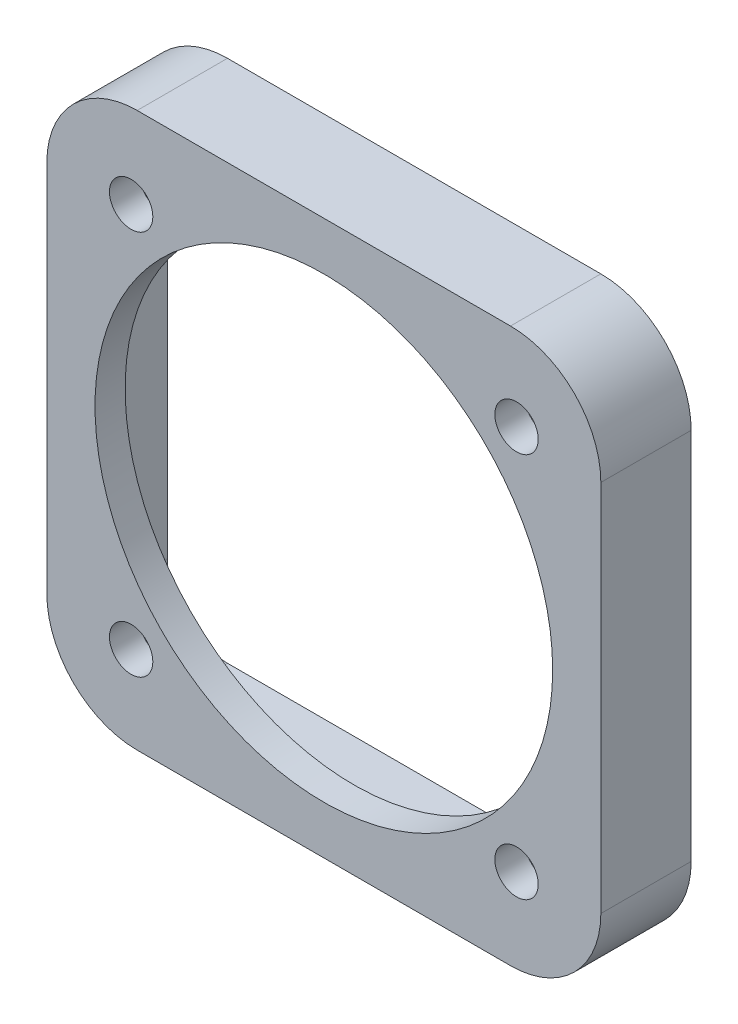
ISO-10303-21;
HEADER;
FILE_DESCRIPTION(('STEP AP214'),'2;1');
FILE_NAME('part.step','',(''),(''),'','','');
FILE_SCHEMA(('AUTOMOTIVE_DESIGN { 1 0 10303 214 1 1 1 1 }'));
ENDSEC;
DATA;
#1=APPLICATION_CONTEXT('core data for automotive mechanical design processes');
#2=APPLICATION_PROTOCOL_DEFINITION('international standard','automotive_design',2000,#1);
#3=PRODUCT_CONTEXT('',#1,'mechanical');
#4=PRODUCT('Part','Part','',(#3));
#5=PRODUCT_RELATED_PRODUCT_CATEGORY('part','',(#4));
#6=PRODUCT_DEFINITION_FORMATION('','',#4);
#7=PRODUCT_DEFINITION_CONTEXT('part definition',#1,'design');
#8=PRODUCT_DEFINITION('design','',#6,#7);
#9=PRODUCT_DEFINITION_SHAPE('','',#8);
#10=(LENGTH_UNIT() NAMED_UNIT(*) SI_UNIT(.MILLI.,.METRE.));
#11=(NAMED_UNIT(*) PLANE_ANGLE_UNIT() SI_UNIT($,.RADIAN.));
#12=(NAMED_UNIT(*) SI_UNIT($,.STERADIAN.) SOLID_ANGLE_UNIT());
#13=UNCERTAINTY_MEASURE_WITH_UNIT(LENGTH_MEASURE(1.E-05),#10,'distance_accuracy_value','');
#14=(GEOMETRIC_REPRESENTATION_CONTEXT(3) GLOBAL_UNCERTAINTY_ASSIGNED_CONTEXT((#13)) GLOBAL_UNIT_ASSIGNED_CONTEXT((#10,
#11,#12)) REPRESENTATION_CONTEXT('',''));
#15=CARTESIAN_POINT('',(0.,0.,0.));
#16=DIRECTION('',(0.,0.,1.));
#17=DIRECTION('',(1.,0.,0.));
#18=AXIS2_PLACEMENT_3D('',#15,#16,#17);
#19=CARTESIAN_POINT('',(0.,166.585877116278,-1997.5));
#20=DIRECTION('',(0.,1.,0.));
#21=DIRECTION('',(0.,0.,1.));
#22=AXIS2_PLACEMENT_3D('',#19,#20,#21);
#23=PLANE('',#22);
#24=DIRECTION('',(0.,0.,-1.));
#25=VECTOR('',#24,1.);
#26=CARTESIAN_POINT('',(133.898971859852,166.585877116278,-1997.5));
#27=LINE('',#26,#25);
#28=CARTESIAN_POINT('',(133.898971859852,166.585877116278,-1997.5));
#29=VERTEX_POINT('',#28);
#30=CARTESIAN_POINT('',(133.898971859852,166.585877116278,-2005.));
#31=VERTEX_POINT('',#30);
#32=EDGE_CURVE('E272',#29,#31,#27,.T.);
#33=ORIENTED_EDGE('',*,*,#32,.T.);
#34=DIRECTION('',(1.,0.,0.));
#35=VECTOR('',#34,1.);
#36=CARTESIAN_POINT('',(102.898971859852,166.585877116278,-2005.));
#37=LINE('',#36,#35);
#38=CARTESIAN_POINT('',(102.898971859852,166.585877116278,-2005.));
#39=VERTEX_POINT('',#38);
#40=EDGE_CURVE('E228',#39,#31,#37,.T.);
#41=ORIENTED_EDGE('',*,*,#40,.F.);
#42=DIRECTION('',(0.,0.,-1.));
#43=VECTOR('',#42,1.);
#44=CARTESIAN_POINT('',(102.898971859852,166.585877116278,-1997.5));
#45=LINE('',#44,#43);
#46=CARTESIAN_POINT('',(102.898971859852,166.585877116278,-1997.5));
#47=VERTEX_POINT('',#46);
#48=EDGE_CURVE('E11',#47,#39,#45,.T.);
#49=ORIENTED_EDGE('',*,*,#48,.F.);
#50=DIRECTION('',(1.,0.,0.));
#51=VECTOR('',#50,1.);
#52=CARTESIAN_POINT('',(0.,166.585877116278,-1997.5));
#53=LINE('',#52,#51);
#54=EDGE_CURVE('E250',#47,#29,#53,.T.);
#55=ORIENTED_EDGE('',*,*,#54,.T.);
#56=EDGE_LOOP('',(#33,#41,#49,#55));
#57=FACE_BOUND('',#56,.T.);
#58=ADVANCED_FACE('F41',(#57),#23,.T.);
#59=CARTESIAN_POINT('',(102.898971859852,159.085877116278,-1997.5));
#60=DIRECTION('',(0.,0.,-1.));
#61=DIRECTION('',(-1.,0.,0.));
#62=AXIS2_PLACEMENT_3D('',#59,#60,#61);
#63=CYLINDRICAL_SURFACE('',#62,7.49999999999999);
#64=ORIENTED_EDGE('',*,*,#48,.T.);
#65=CARTESIAN_POINT('',(102.898971859852,159.085877116278,-2005.));
#66=DIRECTION('',(0.,0.,-1.));
#67=DIRECTION('',(-1.,0.,0.));
#68=AXIS2_PLACEMENT_3D('',#65,#66,#67);
#69=CIRCLE('',#68,7.49999999999999);
#70=CARTESIAN_POINT('',(95.3989718598517,159.085877116278,-2005.));
#71=VERTEX_POINT('',#70);
#72=EDGE_CURVE('E171',#71,#39,#69,.T.);
#73=ORIENTED_EDGE('',*,*,#72,.F.);
#74=DIRECTION('',(0.,0.,-1.));
#75=VECTOR('',#74,1.);
#76=CARTESIAN_POINT('',(95.3989718598517,159.085877116278,-1997.5));
#77=LINE('',#76,#75);
#78=CARTESIAN_POINT('',(95.3989718598517,159.085877116278,-1997.5));
#79=VERTEX_POINT('',#78);
#80=EDGE_CURVE('E48',#79,#71,#77,.T.);
#81=ORIENTED_EDGE('',*,*,#80,.F.);
#82=CARTESIAN_POINT('',(102.898971859852,159.085877116278,-1997.5));
#83=DIRECTION('',(0.,0.,1.));
#84=DIRECTION('',(1.,0.,0.));
#85=AXIS2_PLACEMENT_3D('',#82,#83,#84);
#86=CIRCLE('',#85,7.49999999999999);
#87=EDGE_CURVE('E253',#47,#79,#86,.T.);
#88=ORIENTED_EDGE('',*,*,#87,.F.);
#89=EDGE_LOOP('',(#64,#73,#81,#88));
#90=FACE_BOUND('',#89,.T.);
#91=ADVANCED_FACE('F295',(#90),#63,.T.);
#92=CARTESIAN_POINT('',(95.3989718598518,0.,-1997.5));
#93=DIRECTION('',(-1.,0.,0.));
#94=DIRECTION('',(0.,-1.,0.));
#95=AXIS2_PLACEMENT_3D('',#92,#93,#94);
#96=PLANE('',#95);
#97=ORIENTED_EDGE('',*,*,#80,.T.);
#98=DIRECTION('',(0.,1.,0.));
#99=VECTOR('',#98,1.);
#100=CARTESIAN_POINT('',(95.3989718598517,128.085877116278,-2005.));
#101=LINE('',#100,#99);
#102=CARTESIAN_POINT('',(95.3989718598517,128.085877116278,-2005.));
#103=VERTEX_POINT('',#102);
#104=EDGE_CURVE('E246',#103,#71,#101,.T.);
#105=ORIENTED_EDGE('',*,*,#104,.F.);
#106=DIRECTION('',(0.,0.,-1.));
#107=VECTOR('',#106,1.);
#108=CARTESIAN_POINT('',(95.3989718598517,128.085877116278,-1997.5));
#109=LINE('',#108,#107);
#110=CARTESIAN_POINT('',(95.3989718598517,128.085877116278,-1997.5));
#111=VERTEX_POINT('',#110);
#112=EDGE_CURVE('E284',#111,#103,#109,.T.);
#113=ORIENTED_EDGE('',*,*,#112,.F.);
#114=DIRECTION('',(0.,1.,0.));
#115=VECTOR('',#114,1.);
#116=CARTESIAN_POINT('',(95.3989718598518,0.,-1997.5));
#117=LINE('',#116,#115);
#118=EDGE_CURVE('E255',#111,#79,#117,.T.);
#119=ORIENTED_EDGE('',*,*,#118,.T.);
#120=EDGE_LOOP('',(#97,#105,#113,#119));
#121=FACE_BOUND('',#120,.T.);
#122=ADVANCED_FACE('F288',(#121),#96,.T.);
#123=CARTESIAN_POINT('',(102.898971859852,128.085877116278,-1997.5));
#124=DIRECTION('',(0.,0.,-1.));
#125=DIRECTION('',(-1.,0.,0.));
#126=AXIS2_PLACEMENT_3D('',#123,#124,#125);
#127=CYLINDRICAL_SURFACE('',#126,7.49999999999999);
#128=ORIENTED_EDGE('',*,*,#112,.T.);
#129=CARTESIAN_POINT('',(102.898971859852,128.085877116278,-2005.));
#130=DIRECTION('',(0.,0.,-1.));
#131=DIRECTION('',(-1.,0.,0.));
#132=AXIS2_PLACEMENT_3D('',#129,#130,#131);
#133=CIRCLE('',#132,7.49999999999999);
#134=CARTESIAN_POINT('',(102.898971859852,120.585877116278,-2005.));
#135=VERTEX_POINT('',#134);
#136=EDGE_CURVE('E243',#135,#103,#133,.T.);
#137=ORIENTED_EDGE('',*,*,#136,.F.);
#138=DIRECTION('',(0.,0.,-1.));
#139=VECTOR('',#138,1.);
#140=CARTESIAN_POINT('',(102.898971859852,120.585877116278,-1997.5));
#141=LINE('',#140,#139);
#142=CARTESIAN_POINT('',(102.898971859852,120.585877116278,-1997.5));
#143=VERTEX_POINT('',#142);
#144=EDGE_CURVE('E282',#143,#135,#141,.T.);
#145=ORIENTED_EDGE('',*,*,#144,.F.);
#146=CARTESIAN_POINT('',(102.898971859852,128.085877116278,-1997.5));
#147=DIRECTION('',(0.,0.,1.));
#148=DIRECTION('',(1.,0.,0.));
#149=AXIS2_PLACEMENT_3D('',#146,#147,#148);
#150=CIRCLE('',#149,7.49999999999999);
#151=EDGE_CURVE('E258',#111,#143,#150,.T.);
#152=ORIENTED_EDGE('',*,*,#151,.F.);
#153=EDGE_LOOP('',(#128,#137,#145,#152));
#154=FACE_BOUND('',#153,.T.);
#155=ADVANCED_FACE('F315',(#154),#127,.T.);
#156=CARTESIAN_POINT('',(0.,120.585877116278,-1997.5));
#157=DIRECTION('',(0.,-1.,0.));
#158=DIRECTION('',(1.,0.,0.));
#159=AXIS2_PLACEMENT_3D('',#156,#157,#158);
#160=PLANE('',#159);
#161=ORIENTED_EDGE('',*,*,#144,.T.);
#162=DIRECTION('',(-1.,0.,0.));
#163=VECTOR('',#162,1.);
#164=CARTESIAN_POINT('',(133.898971859852,120.585877116278,-2005.));
#165=LINE('',#164,#163);
#166=CARTESIAN_POINT('',(133.898971859852,120.585877116278,-2005.));
#167=VERTEX_POINT('',#166);
#168=EDGE_CURVE('E240',#167,#135,#165,.T.);
#169=ORIENTED_EDGE('',*,*,#168,.F.);
#170=DIRECTION('',(0.,0.,-1.));
#171=VECTOR('',#170,1.);
#172=CARTESIAN_POINT('',(133.898971859852,120.585877116278,-1997.5));
#173=LINE('',#172,#171);
#174=CARTESIAN_POINT('',(133.898971859852,120.585877116278,-1997.5));
#175=VERTEX_POINT('',#174);
#176=EDGE_CURVE('E280',#175,#167,#173,.T.);
#177=ORIENTED_EDGE('',*,*,#176,.F.);
#178=DIRECTION('',(-1.,0.,0.));
#179=VECTOR('',#178,1.);
#180=CARTESIAN_POINT('',(0.,120.585877116278,-1997.5));
#181=LINE('',#180,#179);
#182=EDGE_CURVE('E260',#175,#143,#181,.T.);
#183=ORIENTED_EDGE('',*,*,#182,.T.);
#184=EDGE_LOOP('',(#161,#169,#177,#183));
#185=FACE_BOUND('',#184,.T.);
#186=ADVANCED_FACE('F312',(#185),#160,.T.);
#187=CARTESIAN_POINT('',(133.898971859852,128.085877116278,-1997.5));
#188=DIRECTION('',(0.,0.,-1.));
#189=DIRECTION('',(-1.,0.,0.));
#190=AXIS2_PLACEMENT_3D('',#187,#188,#189);
#191=CYLINDRICAL_SURFACE('',#190,7.49999999999998);
#192=ORIENTED_EDGE('',*,*,#176,.T.);
#193=CARTESIAN_POINT('',(133.898971859852,128.085877116278,-2005.));
#194=DIRECTION('',(0.,0.,-1.));
#195=DIRECTION('',(-1.,0.,0.));
#196=AXIS2_PLACEMENT_3D('',#193,#194,#195);
#197=CIRCLE('',#196,7.49999999999998);
#198=CARTESIAN_POINT('',(141.398971859852,128.085877116278,-2005.));
#199=VERTEX_POINT('',#198);
#200=EDGE_CURVE('E237',#199,#167,#197,.T.);
#201=ORIENTED_EDGE('',*,*,#200,.F.);
#202=DIRECTION('',(0.,0.,-1.));
#203=VECTOR('',#202,1.);
#204=CARTESIAN_POINT('',(141.398971859852,128.085877116278,-1997.5));
#205=LINE('',#204,#203);
#206=CARTESIAN_POINT('',(141.398971859852,128.085877116278,-1997.5));
#207=VERTEX_POINT('',#206);
#208=EDGE_CURVE('E278',#207,#199,#205,.T.);
#209=ORIENTED_EDGE('',*,*,#208,.F.);
#210=CARTESIAN_POINT('',(133.898971859852,128.085877116278,-1997.5));
#211=DIRECTION('',(0.,0.,1.));
#212=DIRECTION('',(1.,0.,0.));
#213=AXIS2_PLACEMENT_3D('',#210,#211,#212);
#214=CIRCLE('',#213,7.49999999999998);
#215=EDGE_CURVE('E263',#175,#207,#214,.T.);
#216=ORIENTED_EDGE('',*,*,#215,.F.);
#217=EDGE_LOOP('',(#192,#201,#209,#216));
#218=FACE_BOUND('',#217,.T.);
#219=ADVANCED_FACE('F308',(#218),#191,.T.);
#220=CARTESIAN_POINT('',(141.398971859852,0.,-1997.5));
#221=DIRECTION('',(1.,0.,0.));
#222=DIRECTION('',(0.,0.,-1.));
#223=AXIS2_PLACEMENT_3D('',#220,#221,#222);
#224=PLANE('',#223);
#225=ORIENTED_EDGE('',*,*,#208,.T.);
#226=DIRECTION('',(0.,-1.,0.));
#227=VECTOR('',#226,1.);
#228=CARTESIAN_POINT('',(141.398971859852,159.085877116278,-2005.));
#229=LINE('',#228,#227);
#230=CARTESIAN_POINT('',(141.398971859852,159.085877116278,-2005.));
#231=VERTEX_POINT('',#230);
#232=EDGE_CURVE('E234',#231,#199,#229,.T.);
#233=ORIENTED_EDGE('',*,*,#232,.F.);
#234=DIRECTION('',(0.,0.,-1.));
#235=VECTOR('',#234,1.);
#236=CARTESIAN_POINT('',(141.398971859852,159.085877116278,-1997.5));
#237=LINE('',#236,#235);
#238=CARTESIAN_POINT('',(141.398971859852,159.085877116278,-1997.5));
#239=VERTEX_POINT('',#238);
#240=EDGE_CURVE('E276',#239,#231,#237,.T.);
#241=ORIENTED_EDGE('',*,*,#240,.F.);
#242=DIRECTION('',(0.,-1.,0.));
#243=VECTOR('',#242,1.);
#244=CARTESIAN_POINT('',(141.398971859852,0.,-1997.5));
#245=LINE('',#244,#243);
#246=EDGE_CURVE('E265',#239,#207,#245,.T.);
#247=ORIENTED_EDGE('',*,*,#246,.T.);
#248=EDGE_LOOP('',(#225,#233,#241,#247));
#249=FACE_BOUND('',#248,.T.);
#250=ADVANCED_FACE('F303',(#249),#224,.T.);
#251=CARTESIAN_POINT('',(133.898971859852,159.085877116278,-1997.5));
#252=DIRECTION('',(0.,0.,-1.));
#253=DIRECTION('',(-1.,0.,0.));
#254=AXIS2_PLACEMENT_3D('',#251,#252,#253);
#255=CYLINDRICAL_SURFACE('',#254,7.49999999999998);
#256=ORIENTED_EDGE('',*,*,#240,.T.);
#257=CARTESIAN_POINT('',(133.898971859852,159.085877116278,-2005.));
#258=DIRECTION('',(0.,0.,-1.));
#259=DIRECTION('',(-1.,0.,0.));
#260=AXIS2_PLACEMENT_3D('',#257,#258,#259);
#261=CIRCLE('',#260,7.49999999999998);
#262=EDGE_CURVE('E231',#31,#231,#261,.T.);
#263=ORIENTED_EDGE('',*,*,#262,.F.);
#264=ORIENTED_EDGE('',*,*,#32,.F.);
#265=CARTESIAN_POINT('',(133.898971859852,159.085877116278,-1997.5));
#266=DIRECTION('',(0.,0.,1.));
#267=DIRECTION('',(1.,0.,0.));
#268=AXIS2_PLACEMENT_3D('',#265,#266,#267);
#269=CIRCLE('',#268,7.49999999999998);
#270=EDGE_CURVE('E63',#239,#29,#269,.T.);
#271=ORIENTED_EDGE('',*,*,#270,.F.);
#272=EDGE_LOOP('',(#256,#263,#264,#271));
#273=FACE_BOUND('',#272,.T.);
#274=ADVANCED_FACE('F301',(#273),#255,.T.);
#275=CARTESIAN_POINT('',(118.398971859852,143.585877116278,-1997.5));
#276=DIRECTION('',(0.,0.,-1.));
#277=DIRECTION('',(-1.,0.,0.));
#278=AXIS2_PLACEMENT_3D('',#275,#276,#277);
#279=CYLINDRICAL_SURFACE('',#278,19.);
#280=CARTESIAN_POINT('',(118.398971859852,143.585877116278,-1997.5));
#281=DIRECTION('',(0.,0.,1.));
#282=DIRECTION('',(1.,0.,0.));
#283=AXIS2_PLACEMENT_3D('',#280,#281,#282);
#284=CIRCLE('',#283,19.);
#285=CARTESIAN_POINT('',(137.398971859852,143.585877116278,-1997.5));
#286=VERTEX_POINT('',#285);
#287=EDGE_CURVE('E269',#286,#286,#284,.T.);
#288=ORIENTED_EDGE('',*,*,#287,.T.);
#289=EDGE_LOOP('',(#288));
#290=FACE_BOUND('',#289,.T.);
#291=CARTESIAN_POINT('',(118.398971859852,143.585877116278,-2000.));
#292=DIRECTION('',(0.,0.,1.));
#293=DIRECTION('',(1.,0.,0.));
#294=AXIS2_PLACEMENT_3D('',#291,#292,#293);
#295=CIRCLE('',#294,19.);
#296=CARTESIAN_POINT('',(137.398971859852,143.585877116278,-2000.));
#297=VERTEX_POINT('',#296);
#298=EDGE_CURVE('E249',#297,#297,#295,.T.);
#299=ORIENTED_EDGE('',*,*,#298,.F.);
#300=EDGE_LOOP('',(#299));
#301=FACE_BOUND('',#300,.T.);
#302=ADVANCED_FACE('F321',(#290,#301),#279,.F.);
#303=CARTESIAN_POINT('',(0.,0.,-1997.5));
#304=DIRECTION('',(0.,0.,1.));
#305=DIRECTION('',(1.,0.,0.));
#306=AXIS2_PLACEMENT_3D('',#303,#304,#305);
#307=PLANE('',#306);
#308=CARTESIAN_POINT('',(102.398971859852,159.585877116278,-1997.5));
#309=DIRECTION('',(0.,0.,1.));
#310=DIRECTION('',(1.,0.,0.));
#311=AXIS2_PLACEMENT_3D('',#308,#309,#310);
#312=CIRCLE('',#311,1.79999999999998);
#313=CARTESIAN_POINT('',(104.198971859852,159.585877116278,-1997.5));
#314=VERTEX_POINT('',#313);
#315=EDGE_CURVE('E601',#314,#314,#312,.T.);
#316=ORIENTED_EDGE('',*,*,#315,.F.);
#317=EDGE_LOOP('',(#316));
#318=FACE_BOUND('',#317,.T.);
#319=CARTESIAN_POINT('',(102.398971859852,127.585877116278,-1997.5));
#320=DIRECTION('',(0.,0.,1.));
#321=DIRECTION('',(1.,0.,0.));
#322=AXIS2_PLACEMENT_3D('',#319,#320,#321);
#323=CIRCLE('',#322,1.79999999999998);
#324=CARTESIAN_POINT('',(104.198971859852,127.585877116278,-1997.5));
#325=VERTEX_POINT('',#324);
#326=EDGE_CURVE('E603',#325,#325,#323,.T.);
#327=ORIENTED_EDGE('',*,*,#326,.F.);
#328=EDGE_LOOP('',(#327));
#329=FACE_BOUND('',#328,.T.);
#330=CARTESIAN_POINT('',(134.398971859852,127.585877116278,-1997.5));
#331=DIRECTION('',(0.,0.,1.));
#332=DIRECTION('',(1.,0.,0.));
#333=AXIS2_PLACEMENT_3D('',#330,#331,#332);
#334=CIRCLE('',#333,1.8);
#335=CARTESIAN_POINT('',(136.198971859852,127.585877116278,-1997.5));
#336=VERTEX_POINT('',#335);
#337=EDGE_CURVE('E611',#336,#336,#334,.T.);
#338=ORIENTED_EDGE('',*,*,#337,.F.);
#339=EDGE_LOOP('',(#338));
#340=FACE_BOUND('',#339,.T.);
#341=CARTESIAN_POINT('',(134.398971859852,159.585877116278,-1997.5));
#342=DIRECTION('',(0.,0.,1.));
#343=DIRECTION('',(1.,0.,0.));
#344=AXIS2_PLACEMENT_3D('',#341,#342,#343);
#345=CIRCLE('',#344,1.8);
#346=CARTESIAN_POINT('',(136.198971859852,159.585877116278,-1997.5));
#347=VERTEX_POINT('',#346);
#348=EDGE_CURVE('E617',#347,#347,#345,.T.);
#349=ORIENTED_EDGE('',*,*,#348,.F.);
#350=EDGE_LOOP('',(#349));
#351=FACE_BOUND('',#350,.T.);
#352=ORIENTED_EDGE('',*,*,#54,.F.);
#353=ORIENTED_EDGE('',*,*,#87,.T.);
#354=ORIENTED_EDGE('',*,*,#118,.F.);
#355=ORIENTED_EDGE('',*,*,#151,.T.);
#356=ORIENTED_EDGE('',*,*,#182,.F.);
#357=ORIENTED_EDGE('',*,*,#215,.T.);
#358=ORIENTED_EDGE('',*,*,#246,.F.);
#359=ORIENTED_EDGE('',*,*,#270,.T.);
#360=EDGE_LOOP('',(#352,#353,#354,#355,#356,#357,#358,#359));
#361=FACE_BOUND('',#360,.T.);
#362=ORIENTED_EDGE('',*,*,#287,.F.);
#363=EDGE_LOOP('',(#362));
#364=FACE_BOUND('',#363,.T.);
#365=ADVANCED_FACE('F317',(#318,#329,#340,#351,#361,#364),#307,.T.);
#366=CARTESIAN_POINT('',(0.,0.,-2000.));
#367=DIRECTION('',(0.,0.,1.));
#368=DIRECTION('',(1.,0.,0.));
#369=AXIS2_PLACEMENT_3D('',#366,#367,#368);
#370=PLANE('',#369);
#371=CARTESIAN_POINT('',(102.398971859852,159.585877116278,-2000.));
#372=DIRECTION('',(0.,0.,1.));
#373=DIRECTION('',(1.,0.,0.));
#374=AXIS2_PLACEMENT_3D('',#371,#372,#373);
#375=CIRCLE('',#374,1.79999999999999);
#376=CARTESIAN_POINT('',(104.198971859852,159.585877116278,-2000.));
#377=VERTEX_POINT('',#376);
#378=EDGE_CURVE('E598',#377,#377,#375,.T.);
#379=ORIENTED_EDGE('',*,*,#378,.T.);
#380=EDGE_LOOP('',(#379));
#381=FACE_BOUND('',#380,.T.);
#382=CARTESIAN_POINT('',(102.398971859852,127.585877116278,-2000.));
#383=DIRECTION('',(0.,0.,1.));
#384=DIRECTION('',(1.,0.,0.));
#385=AXIS2_PLACEMENT_3D('',#382,#383,#384);
#386=CIRCLE('',#385,1.79999999999999);
#387=CARTESIAN_POINT('',(104.198971859852,127.585877116278,-2000.));
#388=VERTEX_POINT('',#387);
#389=EDGE_CURVE('E608',#388,#388,#386,.T.);
#390=ORIENTED_EDGE('',*,*,#389,.T.);
#391=EDGE_LOOP('',(#390));
#392=FACE_BOUND('',#391,.T.);
#393=CARTESIAN_POINT('',(134.398971859852,127.585877116278,-2000.));
#394=DIRECTION('',(0.,0.,1.));
#395=DIRECTION('',(1.,0.,0.));
#396=AXIS2_PLACEMENT_3D('',#393,#394,#395);
#397=CIRCLE('',#396,1.8);
#398=CARTESIAN_POINT('',(136.198971859852,127.585877116278,-2000.));
#399=VERTEX_POINT('',#398);
#400=EDGE_CURVE('E614',#399,#399,#397,.T.);
#401=ORIENTED_EDGE('',*,*,#400,.T.);
#402=EDGE_LOOP('',(#401));
#403=FACE_BOUND('',#402,.T.);
#404=CARTESIAN_POINT('',(134.398971859852,159.585877116278,-2000.));
#405=DIRECTION('',(0.,0.,1.));
#406=DIRECTION('',(1.,0.,0.));
#407=AXIS2_PLACEMENT_3D('',#404,#405,#406);
#408=CIRCLE('',#407,1.8);
#409=CARTESIAN_POINT('',(136.198971859852,159.585877116278,-2000.));
#410=VERTEX_POINT('',#409);
#411=EDGE_CURVE('E195',#410,#410,#408,.T.);
#412=ORIENTED_EDGE('',*,*,#411,.T.);
#413=EDGE_LOOP('',(#412));
#414=FACE_BOUND('',#413,.T.);
#415=DIRECTION('',(0.,1.,0.));
#416=VECTOR('',#415,1.);
#417=CARTESIAN_POINT('',(97.8989718598517,128.085877116278,-2000.));
#418=LINE('',#417,#416);
#419=CARTESIAN_POINT('',(97.8989718598517,128.085877116278,-2000.));
#420=VERTEX_POINT('',#419);
#421=CARTESIAN_POINT('',(97.8989718598517,159.085877116278,-2000.));
#422=VERTEX_POINT('',#421);
#423=EDGE_CURVE('E164',#420,#422,#418,.T.);
#424=ORIENTED_EDGE('',*,*,#423,.T.);
#425=CARTESIAN_POINT('',(102.898971859852,159.085877116278,-2000.));
#426=DIRECTION('',(0.,0.,-1.));
#427=DIRECTION('',(-1.,0.,0.));
#428=AXIS2_PLACEMENT_3D('',#425,#426,#427);
#429=CIRCLE('',#428,4.99999999999998);
#430=CARTESIAN_POINT('',(102.898971859852,164.085877116278,-2000.));
#431=VERTEX_POINT('',#430);
#432=EDGE_CURVE('E193',#422,#431,#429,.T.);
#433=ORIENTED_EDGE('',*,*,#432,.T.);
#434=DIRECTION('',(1.,0.,0.));
#435=VECTOR('',#434,1.);
#436=CARTESIAN_POINT('',(102.898971859852,164.085877116278,-2000.));
#437=LINE('',#436,#435);
#438=CARTESIAN_POINT('',(133.898971859852,164.085877116278,-2000.));
#439=VERTEX_POINT('',#438);
#440=EDGE_CURVE('E170',#431,#439,#437,.T.);
#441=ORIENTED_EDGE('',*,*,#440,.T.);
#442=CARTESIAN_POINT('',(133.898971859852,159.085877116278,-2000.));
#443=DIRECTION('',(0.,0.,-1.));
#444=DIRECTION('',(-1.,0.,0.));
#445=AXIS2_PLACEMENT_3D('',#442,#443,#444);
#446=CIRCLE('',#445,4.99999999999998);
#447=CARTESIAN_POINT('',(138.898971859852,159.085877116278,-2000.));
#448=VERTEX_POINT('',#447);
#449=EDGE_CURVE('E197',#439,#448,#446,.T.);
#450=ORIENTED_EDGE('',*,*,#449,.T.);
#451=DIRECTION('',(0.,-1.,0.));
#452=VECTOR('',#451,1.);
#453=CARTESIAN_POINT('',(138.898971859852,159.085877116278,-2000.));
#454=LINE('',#453,#452);
#455=CARTESIAN_POINT('',(138.898971859852,128.085877116278,-2000.));
#456=VERTEX_POINT('',#455);
#457=EDGE_CURVE('E200',#448,#456,#454,.T.);
#458=ORIENTED_EDGE('',*,*,#457,.T.);
#459=CARTESIAN_POINT('',(133.898971859852,128.085877116278,-2000.));
#460=DIRECTION('',(0.,0.,-1.));
#461=DIRECTION('',(-1.,0.,0.));
#462=AXIS2_PLACEMENT_3D('',#459,#460,#461);
#463=CIRCLE('',#462,4.99999999999998);
#464=CARTESIAN_POINT('',(133.898971859852,123.085877116278,-2000.));
#465=VERTEX_POINT('',#464);
#466=EDGE_CURVE('E203',#456,#465,#463,.T.);
#467=ORIENTED_EDGE('',*,*,#466,.T.);
#468=DIRECTION('',(-1.,0.,0.));
#469=VECTOR('',#468,1.);
#470=CARTESIAN_POINT('',(133.898971859852,123.085877116278,-2000.));
#471=LINE('',#470,#469);
#472=CARTESIAN_POINT('',(102.898971859852,123.085877116278,-2000.));
#473=VERTEX_POINT('',#472);
#474=EDGE_CURVE('E206',#465,#473,#471,.T.);
#475=ORIENTED_EDGE('',*,*,#474,.T.);
#476=CARTESIAN_POINT('',(102.898971859852,128.085877116278,-2000.));
#477=DIRECTION('',(0.,0.,-1.));
#478=DIRECTION('',(-1.,0.,0.));
#479=AXIS2_PLACEMENT_3D('',#476,#477,#478);
#480=CIRCLE('',#479,4.99999999999998);
#481=EDGE_CURVE('E209',#473,#420,#480,.T.);
#482=ORIENTED_EDGE('',*,*,#481,.T.);
#483=EDGE_LOOP('',(#424,#433,#441,#450,#458,#467,#475,#482));
#484=FACE_BOUND('',#483,.T.);
#485=ORIENTED_EDGE('',*,*,#298,.T.);
#486=EDGE_LOOP('',(#485));
#487=FACE_BOUND('',#486,.T.);
#488=ADVANCED_FACE('F320',(#381,#392,#403,#414,#484,#487),#370,.F.);
#489=CARTESIAN_POINT('',(102.898971859852,159.085877116278,-2005.));
#490=DIRECTION('',(0.,0.,-1.));
#491=DIRECTION('',(-1.,0.,0.));
#492=AXIS2_PLACEMENT_3D('',#489,#490,#491);
#493=PLANE('',#492);
#494=ORIENTED_EDGE('',*,*,#72,.T.);
#495=ORIENTED_EDGE('',*,*,#40,.T.);
#496=ORIENTED_EDGE('',*,*,#262,.T.);
#497=ORIENTED_EDGE('',*,*,#232,.T.);
#498=ORIENTED_EDGE('',*,*,#200,.T.);
#499=ORIENTED_EDGE('',*,*,#168,.T.);
#500=ORIENTED_EDGE('',*,*,#136,.T.);
#501=ORIENTED_EDGE('',*,*,#104,.T.);
#502=EDGE_LOOP('',(#494,#495,#496,#497,#498,#499,#500,#501));
#503=FACE_BOUND('',#502,.T.);
#504=DIRECTION('',(1.,0.,0.));
#505=VECTOR('',#504,1.);
#506=CARTESIAN_POINT('',(102.898971859852,164.085877116278,-2005.));
#507=LINE('',#506,#505);
#508=CARTESIAN_POINT('',(102.898971859852,164.085877116278,-2005.));
#509=VERTEX_POINT('',#508);
#510=CARTESIAN_POINT('',(133.898971859852,164.085877116278,-2005.));
#511=VERTEX_POINT('',#510);
#512=EDGE_CURVE('E163',#509,#511,#507,.T.);
#513=ORIENTED_EDGE('',*,*,#512,.F.);
#514=CARTESIAN_POINT('',(102.898971859852,159.085877116278,-2005.));
#515=DIRECTION('',(0.,0.,-1.));
#516=DIRECTION('',(-1.,0.,0.));
#517=AXIS2_PLACEMENT_3D('',#514,#515,#516);
#518=CIRCLE('',#517,4.99999999999998);
#519=CARTESIAN_POINT('',(97.8989718598517,159.085877116278,-2005.));
#520=VERTEX_POINT('',#519);
#521=EDGE_CURVE('E155',#520,#509,#518,.T.);
#522=ORIENTED_EDGE('',*,*,#521,.F.);
#523=DIRECTION('',(0.,1.,0.));
#524=VECTOR('',#523,1.);
#525=CARTESIAN_POINT('',(97.8989718598517,128.085877116278,-2005.));
#526=LINE('',#525,#524);
#527=CARTESIAN_POINT('',(97.8989718598517,128.085877116278,-2005.));
#528=VERTEX_POINT('',#527);
#529=EDGE_CURVE('E191',#528,#520,#526,.T.);
#530=ORIENTED_EDGE('',*,*,#529,.F.);
#531=CARTESIAN_POINT('',(102.898971859852,128.085877116278,-2005.));
#532=DIRECTION('',(0.,0.,-1.));
#533=DIRECTION('',(-1.,0.,0.));
#534=AXIS2_PLACEMENT_3D('',#531,#532,#533);
#535=CIRCLE('',#534,4.99999999999998);
#536=CARTESIAN_POINT('',(102.898971859852,123.085877116278,-2005.));
#537=VERTEX_POINT('',#536);
#538=EDGE_CURVE('E188',#537,#528,#535,.T.);
#539=ORIENTED_EDGE('',*,*,#538,.F.);
#540=DIRECTION('',(-1.,0.,0.));
#541=VECTOR('',#540,1.);
#542=CARTESIAN_POINT('',(133.898971859852,123.085877116278,-2005.));
#543=LINE('',#542,#541);
#544=CARTESIAN_POINT('',(133.898971859852,123.085877116278,-2005.));
#545=VERTEX_POINT('',#544);
#546=EDGE_CURVE('E186',#545,#537,#543,.T.);
#547=ORIENTED_EDGE('',*,*,#546,.F.);
#548=CARTESIAN_POINT('',(133.898971859852,128.085877116278,-2005.));
#549=DIRECTION('',(0.,0.,-1.));
#550=DIRECTION('',(-1.,0.,0.));
#551=AXIS2_PLACEMENT_3D('',#548,#549,#550);
#552=CIRCLE('',#551,4.99999999999998);
#553=CARTESIAN_POINT('',(138.898971859852,128.085877116278,-2005.));
#554=VERTEX_POINT('',#553);
#555=EDGE_CURVE('E184',#554,#545,#552,.T.);
#556=ORIENTED_EDGE('',*,*,#555,.F.);
#557=DIRECTION('',(0.,-1.,0.));
#558=VECTOR('',#557,1.);
#559=CARTESIAN_POINT('',(138.898971859852,159.085877116278,-2005.));
#560=LINE('',#559,#558);
#561=CARTESIAN_POINT('',(138.898971859852,159.085877116278,-2005.));
#562=VERTEX_POINT('',#561);
#563=EDGE_CURVE('E179',#562,#554,#560,.T.);
#564=ORIENTED_EDGE('',*,*,#563,.F.);
#565=CARTESIAN_POINT('',(133.898971859852,159.085877116278,-2005.));
#566=DIRECTION('',(0.,0.,-1.));
#567=DIRECTION('',(-1.,0.,0.));
#568=AXIS2_PLACEMENT_3D('',#565,#566,#567);
#569=CIRCLE('',#568,4.99999999999998);
#570=EDGE_CURVE('E177',#511,#562,#569,.T.);
#571=ORIENTED_EDGE('',*,*,#570,.F.);
#572=EDGE_LOOP('',(#513,#522,#530,#539,#547,#556,#564,#571));
#573=FACE_BOUND('',#572,.T.);
#574=ADVANCED_FACE('F175',(#503,#573),#493,.T.);
#575=CARTESIAN_POINT('',(102.898971859852,159.085877116278,-2005.));
#576=DIRECTION('',(0.,0.,1.));
#577=DIRECTION('',(1.,0.,0.));
#578=AXIS2_PLACEMENT_3D('',#575,#576,#577);
#579=CYLINDRICAL_SURFACE('',#578,4.99999999999998);
#580=ORIENTED_EDGE('',*,*,#432,.F.);
#581=DIRECTION('',(0.,0.,1.));
#582=VECTOR('',#581,1.);
#583=CARTESIAN_POINT('',(97.8989718598517,159.085877116278,-2005.));
#584=LINE('',#583,#582);
#585=EDGE_CURVE('E55',#520,#422,#584,.T.);
#586=ORIENTED_EDGE('',*,*,#585,.F.);
#587=ORIENTED_EDGE('',*,*,#521,.T.);
#588=DIRECTION('',(0.,0.,1.));
#589=VECTOR('',#588,1.);
#590=CARTESIAN_POINT('',(102.898971859852,164.085877116278,-2005.));
#591=LINE('',#590,#589);
#592=EDGE_CURVE('E158',#509,#431,#591,.T.);
#593=ORIENTED_EDGE('',*,*,#592,.T.);
#594=EDGE_LOOP('',(#580,#586,#587,#593));
#595=FACE_BOUND('',#594,.T.);
#596=ADVANCED_FACE('F157',(#595),#579,.F.);
#597=CARTESIAN_POINT('',(102.898971859852,164.085877116278,-2005.));
#598=DIRECTION('',(0.,-1.,0.));
#599=DIRECTION('',(0.,0.,-1.));
#600=AXIS2_PLACEMENT_3D('',#597,#598,#599);
#601=PLANE('',#600);
#602=ORIENTED_EDGE('',*,*,#440,.F.);
#603=ORIENTED_EDGE('',*,*,#592,.F.);
#604=ORIENTED_EDGE('',*,*,#512,.T.);
#605=DIRECTION('',(0.,0.,1.));
#606=VECTOR('',#605,1.);
#607=CARTESIAN_POINT('',(133.898971859852,164.085877116278,-2005.));
#608=LINE('',#607,#606);
#609=EDGE_CURVE('E172',#511,#439,#608,.T.);
#610=ORIENTED_EDGE('',*,*,#609,.T.);
#611=EDGE_LOOP('',(#602,#603,#604,#610));
#612=FACE_BOUND('',#611,.T.);
#613=ADVANCED_FACE('F167',(#612),#601,.T.);
#614=CARTESIAN_POINT('',(133.898971859852,159.085877116278,-2005.));
#615=DIRECTION('',(0.,0.,1.));
#616=DIRECTION('',(1.,0.,0.));
#617=AXIS2_PLACEMENT_3D('',#614,#615,#616);
#618=CYLINDRICAL_SURFACE('',#617,4.99999999999998);
#619=ORIENTED_EDGE('',*,*,#449,.F.);
#620=ORIENTED_EDGE('',*,*,#609,.F.);
#621=ORIENTED_EDGE('',*,*,#570,.T.);
#622=DIRECTION('',(0.,0.,1.));
#623=VECTOR('',#622,1.);
#624=CARTESIAN_POINT('',(138.898971859852,159.085877116278,-2005.));
#625=LINE('',#624,#623);
#626=EDGE_CURVE('E223',#562,#448,#625,.T.);
#627=ORIENTED_EDGE('',*,*,#626,.T.);
#628=EDGE_LOOP('',(#619,#620,#621,#627));
#629=FACE_BOUND('',#628,.T.);
#630=ADVANCED_FACE('F382',(#629),#618,.F.);
#631=CARTESIAN_POINT('',(138.898971859852,159.085877116278,-2005.));
#632=DIRECTION('',(-1.,0.,0.));
#633=DIRECTION('',(0.,0.,1.));
#634=AXIS2_PLACEMENT_3D('',#631,#632,#633);
#635=PLANE('',#634);
#636=ORIENTED_EDGE('',*,*,#457,.F.);
#637=ORIENTED_EDGE('',*,*,#626,.F.);
#638=ORIENTED_EDGE('',*,*,#563,.T.);
#639=DIRECTION('',(0.,0.,1.));
#640=VECTOR('',#639,1.);
#641=CARTESIAN_POINT('',(138.898971859852,128.085877116278,-2005.));
#642=LINE('',#641,#640);
#643=EDGE_CURVE('E221',#554,#456,#642,.T.);
#644=ORIENTED_EDGE('',*,*,#643,.T.);
#645=EDGE_LOOP('',(#636,#637,#638,#644));
#646=FACE_BOUND('',#645,.T.);
#647=ADVANCED_FACE('F390',(#646),#635,.T.);
#648=CARTESIAN_POINT('',(133.898971859852,128.085877116278,-2005.));
#649=DIRECTION('',(0.,0.,1.));
#650=DIRECTION('',(1.,0.,0.));
#651=AXIS2_PLACEMENT_3D('',#648,#649,#650);
#652=CYLINDRICAL_SURFACE('',#651,4.99999999999998);
#653=ORIENTED_EDGE('',*,*,#466,.F.);
#654=ORIENTED_EDGE('',*,*,#643,.F.);
#655=ORIENTED_EDGE('',*,*,#555,.T.);
#656=DIRECTION('',(0.,0.,1.));
#657=VECTOR('',#656,1.);
#658=CARTESIAN_POINT('',(133.898971859852,123.085877116278,-2005.));
#659=LINE('',#658,#657);
#660=EDGE_CURVE('E219',#545,#465,#659,.T.);
#661=ORIENTED_EDGE('',*,*,#660,.T.);
#662=EDGE_LOOP('',(#653,#654,#655,#661));
#663=FACE_BOUND('',#662,.T.);
#664=ADVANCED_FACE('F399',(#663),#652,.F.);
#665=CARTESIAN_POINT('',(133.898971859852,123.085877116278,-2005.));
#666=DIRECTION('',(0.,1.,0.));
#667=DIRECTION('',(0.,0.,1.));
#668=AXIS2_PLACEMENT_3D('',#665,#666,#667);
#669=PLANE('',#668);
#670=ORIENTED_EDGE('',*,*,#474,.F.);
#671=ORIENTED_EDGE('',*,*,#660,.F.);
#672=ORIENTED_EDGE('',*,*,#546,.T.);
#673=DIRECTION('',(0.,0.,1.));
#674=VECTOR('',#673,1.);
#675=CARTESIAN_POINT('',(102.898971859852,123.085877116278,-2005.));
#676=LINE('',#675,#674);
#677=EDGE_CURVE('E217',#537,#473,#676,.T.);
#678=ORIENTED_EDGE('',*,*,#677,.T.);
#679=EDGE_LOOP('',(#670,#671,#672,#678));
#680=FACE_BOUND('',#679,.T.);
#681=ADVANCED_FACE('F408',(#680),#669,.T.);
#682=CARTESIAN_POINT('',(102.898971859852,128.085877116278,-2005.));
#683=DIRECTION('',(0.,0.,1.));
#684=DIRECTION('',(1.,0.,0.));
#685=AXIS2_PLACEMENT_3D('',#682,#683,#684);
#686=CYLINDRICAL_SURFACE('',#685,4.99999999999998);
#687=ORIENTED_EDGE('',*,*,#481,.F.);
#688=ORIENTED_EDGE('',*,*,#677,.F.);
#689=ORIENTED_EDGE('',*,*,#538,.T.);
#690=DIRECTION('',(0.,0.,1.));
#691=VECTOR('',#690,1.);
#692=CARTESIAN_POINT('',(97.8989718598517,128.085877116278,-2005.));
#693=LINE('',#692,#691);
#694=EDGE_CURVE('E215',#528,#420,#693,.T.);
#695=ORIENTED_EDGE('',*,*,#694,.T.);
#696=EDGE_LOOP('',(#687,#688,#689,#695));
#697=FACE_BOUND('',#696,.T.);
#698=ADVANCED_FACE('F417',(#697),#686,.F.);
#699=CARTESIAN_POINT('',(97.8989718598517,128.085877116278,-2005.));
#700=DIRECTION('',(1.,0.,0.));
#701=DIRECTION('',(0.,0.,-1.));
#702=AXIS2_PLACEMENT_3D('',#699,#700,#701);
#703=PLANE('',#702);
#704=ORIENTED_EDGE('',*,*,#423,.F.);
#705=ORIENTED_EDGE('',*,*,#694,.F.);
#706=ORIENTED_EDGE('',*,*,#529,.T.);
#707=ORIENTED_EDGE('',*,*,#585,.T.);
#708=EDGE_LOOP('',(#704,#705,#706,#707));
#709=FACE_BOUND('',#708,.T.);
#710=ADVANCED_FACE('F426',(#709),#703,.T.);
#711=CARTESIAN_POINT('',(134.398971859852,159.585877116278,-1997.5));
#712=DIRECTION('',(0.,0.,1.));
#713=DIRECTION('',(1.,0.,0.));
#714=AXIS2_PLACEMENT_3D('',#711,#712,#713);
#715=CYLINDRICAL_SURFACE('',#714,1.8);
#716=ORIENTED_EDGE('',*,*,#411,.F.);
#717=EDGE_LOOP('',(#716));
#718=FACE_BOUND('',#717,.T.);
#719=ORIENTED_EDGE('',*,*,#348,.T.);
#720=EDGE_LOOP('',(#719));
#721=FACE_BOUND('',#720,.T.);
#722=ADVANCED_FACE('F434',(#718,#721),#715,.F.);
#723=CARTESIAN_POINT('',(134.398971859852,127.585877116278,-1997.5));
#724=DIRECTION('',(0.,0.,1.));
#725=DIRECTION('',(1.,0.,0.));
#726=AXIS2_PLACEMENT_3D('',#723,#724,#725);
#727=CYLINDRICAL_SURFACE('',#726,1.8);
#728=ORIENTED_EDGE('',*,*,#400,.F.);
#729=EDGE_LOOP('',(#728));
#730=FACE_BOUND('',#729,.T.);
#731=ORIENTED_EDGE('',*,*,#337,.T.);
#732=EDGE_LOOP('',(#731));
#733=FACE_BOUND('',#732,.T.);
#734=ADVANCED_FACE('F562',(#730,#733),#727,.F.);
#735=CARTESIAN_POINT('',(102.398971859852,127.585877116278,-1997.5));
#736=DIRECTION('',(0.,0.,1.));
#737=DIRECTION('',(1.,0.,0.));
#738=AXIS2_PLACEMENT_3D('',#735,#736,#737);
#739=CYLINDRICAL_SURFACE('',#738,1.79999999999999);
#740=ORIENTED_EDGE('',*,*,#389,.F.);
#741=EDGE_LOOP('',(#740));
#742=FACE_BOUND('',#741,.T.);
#743=ORIENTED_EDGE('',*,*,#326,.T.);
#744=EDGE_LOOP('',(#743));
#745=FACE_BOUND('',#744,.T.);
#746=ADVANCED_FACE('F571',(#742,#745),#739,.F.);
#747=CARTESIAN_POINT('',(102.398971859852,159.585877116278,-1997.5));
#748=DIRECTION('',(0.,0.,1.));
#749=DIRECTION('',(1.,0.,0.));
#750=AXIS2_PLACEMENT_3D('',#747,#748,#749);
#751=CYLINDRICAL_SURFACE('',#750,1.79999999999999);
#752=ORIENTED_EDGE('',*,*,#378,.F.);
#753=EDGE_LOOP('',(#752));
#754=FACE_BOUND('',#753,.T.);
#755=ORIENTED_EDGE('',*,*,#315,.T.);
#756=EDGE_LOOP('',(#755));
#757=FACE_BOUND('',#756,.T.);
#758=ADVANCED_FACE('F580',(#754,#757),#751,.F.);
#759=CLOSED_SHELL('',(#58,#91,#122,#155,#186,#219,#250,#274,#302,#365,#488,#574,#596,#613,#630,
#647,#664,#681,#698,#710,#722,#734,#746,#758));
#760=MANIFOLD_SOLID_BREP('B2',#759);
#761=ADVANCED_BREP_SHAPE_REPRESENTATION('',(#18,#760),#14);
#762=SHAPE_DEFINITION_REPRESENTATION(#9,#761);
ENDSEC;
END-ISO-10303-21;
